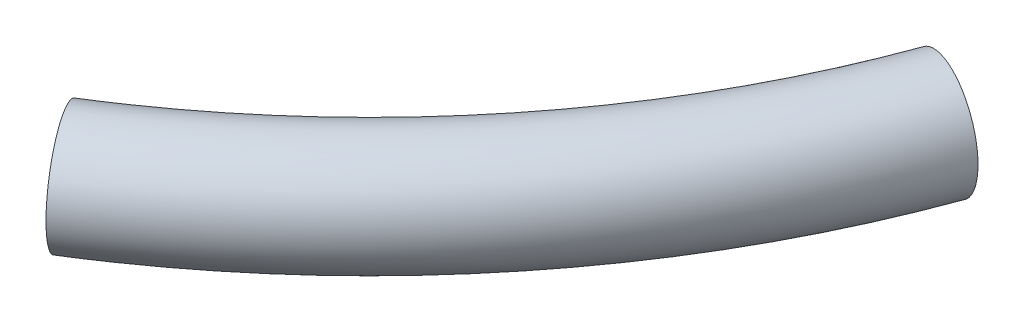
ISO-10303-21;
HEADER;
FILE_DESCRIPTION(('STEP AP214'),'2;1');
FILE_NAME('part.step','',(''),(''),'','','');
FILE_SCHEMA(('AUTOMOTIVE_DESIGN { 1 0 10303 214 1 1 1 1 }'));
ENDSEC;
DATA;
#1=APPLICATION_CONTEXT('core data for automotive mechanical design processes');
#2=APPLICATION_PROTOCOL_DEFINITION('international standard','automotive_design',2000,#1);
#3=PRODUCT_CONTEXT('',#1,'mechanical');
#4=PRODUCT('Part','Part','',(#3));
#5=PRODUCT_RELATED_PRODUCT_CATEGORY('part','',(#4));
#6=PRODUCT_DEFINITION_FORMATION('','',#4);
#7=PRODUCT_DEFINITION_CONTEXT('part definition',#1,'design');
#8=PRODUCT_DEFINITION('design','',#6,#7);
#9=PRODUCT_DEFINITION_SHAPE('','',#8);
#10=(LENGTH_UNIT() NAMED_UNIT(*) SI_UNIT(.MILLI.,.METRE.));
#11=(NAMED_UNIT(*) PLANE_ANGLE_UNIT() SI_UNIT($,.RADIAN.));
#12=(NAMED_UNIT(*) SI_UNIT($,.STERADIAN.) SOLID_ANGLE_UNIT());
#13=UNCERTAINTY_MEASURE_WITH_UNIT(LENGTH_MEASURE(1.E-05),#10,'distance_accuracy_value','');
#14=(GEOMETRIC_REPRESENTATION_CONTEXT(3) GLOBAL_UNCERTAINTY_ASSIGNED_CONTEXT((#13)) GLOBAL_UNIT_ASSIGNED_CONTEXT((#10,
#11,#12)) REPRESENTATION_CONTEXT('',''));
#15=CARTESIAN_POINT('',(0.,0.,0.));
#16=DIRECTION('',(0.,0.,1.));
#17=DIRECTION('',(1.,0.,0.));
#18=AXIS2_PLACEMENT_3D('',#15,#16,#17);
#19=CARTESIAN_POINT('',(0.,6.,0.));
#20=DIRECTION('',(0.342020143325699,0.,-0.939692620785897));
#21=DIRECTION('',(-0.939692620785897,0.,-0.342020143325699));
#22=AXIS2_PLACEMENT_3D('',#19,#20,#21);
#23=PLANE('',#22);
#24=CARTESIAN_POINT('',(6.82421302934355,0.730199999999999,2.48381041497289));
#25=CARTESIAN_POINT('',(6.82421129497327,0.752655241559639,2.48380978371373));
#26=CARTESIAN_POINT('',(6.82242963591551,0.775130857259378,2.4831613128491));
#27=CARTESIAN_POINT('',(6.81534161789126,0.819482451297504,2.48058148526833));
#28=CARTESIAN_POINT('',(6.81002771527244,0.841357041711002,2.47864738288729));
#29=CARTESIAN_POINT('',(6.79603352222431,0.883809618347232,2.47355391316519));
#30=CARTESIAN_POINT('',(6.78735924020571,0.904389843003348,2.47039673270679));
#31=CARTESIAN_POINT('',(6.76687443218714,0.943737337222424,2.46294087233338));
#32=CARTESIAN_POINT('',(6.75505945707419,0.962501982989582,2.45864057307367));
#33=CARTESIAN_POINT('',(6.72865380553962,0.99762748493817,2.44902970189868));
#34=CARTESIAN_POINT('',(6.71406706652031,1.01399169330263,2.44372056308064));
#35=CARTESIAN_POINT('',(6.68249826555502,1.0439048849067,2.4322304591978));
#36=CARTESIAN_POINT('',(6.66551287897885,1.05744989503907,2.42604828406657));
#37=CARTESIAN_POINT('',(6.62965832272644,1.08130194187445,2.41299829282787));
#38=CARTESIAN_POINT('',(6.6107905341322,1.0916113298001,2.40613097939313));
#39=CARTESIAN_POINT('',(6.57169519309986,1.10871348302438,2.39190143895887));
#40=CARTESIAN_POINT('',(6.55146756074491,1.11550604143746,2.38453918287199));
#41=CARTESIAN_POINT('',(6.51022839819317,1.12538061292917,2.36952935521709));
#42=CARTESIAN_POINT('',(6.48921689106719,1.12846273512374,2.36188179204616));
#43=CARTESIAN_POINT('',(6.44700586567826,1.1308293161772,2.34651823524673));
#44=CARTESIAN_POINT('',(6.42580634741531,1.13011377503608,2.33880224161824));
#45=CARTESIAN_POINT('',(6.38382046538139,1.12490525493437,2.32352063029848));
#46=CARTESIAN_POINT('',(6.36303411377941,1.12041216488209,2.31595501703636));
#47=CARTESIAN_POINT('',(6.32246653349717,1.10777635092602,2.30118962533742));
#48=CARTESIAN_POINT('',(6.30268524577036,1.09963384169881,2.2939898254094));
#49=CARTESIAN_POINT('',(6.26467402476153,1.07992311451522,2.28015487239408));
#50=CARTESIAN_POINT('',(6.24644523275613,1.06835240391896,2.27352013469748));
#51=CARTESIAN_POINT('',(6.212097563762,1.04213485030234,2.26101860556719));
#52=CARTESIAN_POINT('',(6.19597577285272,1.02749233015651,2.25515075355315));
#53=CARTESIAN_POINT('',(6.16624800679594,0.99551397474831,2.24433073157725));
#54=CARTESIAN_POINT('',(6.15264561625898,0.97817436557765,2.23937986630693));
#55=CARTESIAN_POINT('',(6.12838903675539,0.941335318357768,2.23055119338251));
#56=CARTESIAN_POINT('',(6.11773068237938,0.921838987081609,2.22667186964338));
#57=CARTESIAN_POINT('',(6.09962219041488,0.881186262625344,2.22008091758085));
#58=CARTESIAN_POINT('',(6.09217780695206,0.860026971539702,2.21737138358792));
#59=CARTESIAN_POINT('',(6.08074974899613,0.816713490035981,2.21321191065649));
#60=CARTESIAN_POINT('',(6.07675870965542,0.794561523394873,2.21175929113269));
#61=CARTESIAN_POINT('',(6.07315247693565,0.758269762147005,2.21044672976486));
#62=CARTESIAN_POINT('',(6.07245784839844,0.744238862857464,2.21019390565344));
#63=CARTESIAN_POINT('',(6.07246066708511,0.707744758440359,2.21019493157149));
#64=CARTESIAN_POINT('',(6.07424232614287,0.685269142740621,2.21084340243612));
#65=CARTESIAN_POINT('',(6.08133034416713,0.640917548702495,2.2134232300169));
#66=CARTESIAN_POINT('',(6.08664424678595,0.619042958288996,2.21535733239793));
#67=CARTESIAN_POINT('',(6.10063843983407,0.576590381652766,2.22045080212003));
#68=CARTESIAN_POINT('',(6.10931272185267,0.55601015699665,2.22360798257843));
#69=CARTESIAN_POINT('',(6.12979752987124,0.516662662777574,2.23106384295185));
#70=CARTESIAN_POINT('',(6.14161250498419,0.497898017010417,2.23536414221156));
#71=CARTESIAN_POINT('',(6.16801815651876,0.462772515061829,2.24497501338655));
#72=CARTESIAN_POINT('',(6.18260489553807,0.446408306697369,2.25028415220459));
#73=CARTESIAN_POINT('',(6.21417369650336,0.4164951150933,2.26177425608743));
#74=CARTESIAN_POINT('',(6.23115908307953,0.402950104960929,2.26795643121866));
#75=CARTESIAN_POINT('',(6.26701363933194,0.379098058125552,2.28100642245736));
#76=CARTESIAN_POINT('',(6.28588142792618,0.368788670199895,2.28787373589209));
#77=CARTESIAN_POINT('',(6.32497676895852,0.351686516975621,2.30210327632635));
#78=CARTESIAN_POINT('',(6.34520440131347,0.344893958562538,2.30946553241323));
#79=CARTESIAN_POINT('',(6.38644356386521,0.335019387070832,2.32447536006813));
#80=CARTESIAN_POINT('',(6.40745507099119,0.331937264876256,2.33212292323906));
#81=CARTESIAN_POINT('',(6.44966609638013,0.329570683822803,2.34748648003849));
#82=CARTESIAN_POINT('',(6.47086561464308,0.330286224963925,2.35520247366699));
#83=CARTESIAN_POINT('',(6.51285149667699,0.335494745065634,2.37048408498675));
#84=CARTESIAN_POINT('',(6.53363784827897,0.339987835117909,2.37804969824886));
#85=CARTESIAN_POINT('',(6.57420542856121,0.352623649073977,2.39281508994781));
#86=CARTESIAN_POINT('',(6.59398671628802,0.360766158301187,2.40001488987582));
#87=CARTESIAN_POINT('',(6.63199793729685,0.380476885484782,2.41384984289115));
#88=CARTESIAN_POINT('',(6.65022672930225,0.392047596081044,2.42048458058774));
#89=CARTESIAN_POINT('',(6.68457439829638,0.418265149697663,2.43298610971804));
#90=CARTESIAN_POINT('',(6.70069618920566,0.432907669843493,2.43885396173208));
#91=CARTESIAN_POINT('',(6.73042395526245,0.464886025251691,2.44967398370798));
#92=CARTESIAN_POINT('',(6.7440263457994,0.482225634422351,2.4546248489783));
#93=CARTESIAN_POINT('',(6.76828292530299,0.519064681642234,2.46345352190271));
#94=CARTESIAN_POINT('',(6.778941279679,0.538561012918393,2.46733284564184));
#95=CARTESIAN_POINT('',(6.79704977164351,0.579213737374658,2.47392379770437));
#96=CARTESIAN_POINT('',(6.80449415510633,0.6003730284603,2.4766333316973));
#97=CARTESIAN_POINT('',(6.81592221306226,0.64368650996402,2.48079280462873));
#98=CARTESIAN_POINT('',(6.81991325240296,0.665838476605129,2.48224542415254));
#99=CARTESIAN_POINT('',(6.82351948512273,0.702130237852995,2.48355798552037));
#100=CARTESIAN_POINT('',(6.82421411365994,0.716161137142535,2.48381080963178));
#101=CARTESIAN_POINT('',(6.82421302934355,0.730199999999999,2.48381041497289));
#102=B_SPLINE_CURVE_WITH_KNOTS('',3,(#24,#25,#26,#27,#28,#29,#30,#31,#32,#33,#34,#35,#36,#37,
#38,#39,#40,#41,#42,#43,#44,#45,#46,#47,#48,#49,#50,#51,#52,#53,#54,#55,#56,#57,#58,#59,#60,#61,
#62,#63,#64,#65,#66,#67,#68,#69,#70,#71,#72,#73,#74,#75,#76,#77,#78,#79,#80,#81,#82,#83,#84,#85,
#86,#87,#88,#89,#90,#91,#92,#93,#94,#95,#96,#97,#98,#99,#100,#101),.UNSPECIFIED.,.T.,.F.,(4,2,2,
2,2,2,2,2,2,2,2,2,2,2,2,2,2,2,2,2,2,2,2,2,2,2,2,2,2,2,2,2,2,2,2,2,2,2,4),(0.,0.0673217190940752,
0.134787678055461,0.2021335594909,0.269575356418626,0.336922056232695,0.40436303479347,
0.471754892083668,0.539150713403567,0.606544552708822,0.673938392014078,0.741334213333977,
0.808726070624174,0.876167049184948,0.94351374899902,1.01095554592846,1.07830142736561,
1.14576738632871,1.2130891054245,1.25517818200736,1.32249990110144,1.38996586006282,
1.45731174149826,1.52475353842599,1.59210023824006,1.65954121680083,1.72693307409103,
1.79432889541093,1.86172273471619,1.92911657402144,1.99651239534134,2.06390425263154,
2.13134523119231,2.19869193100638,2.26613372793582,2.33347960937297,2.40094556833608,
2.46826728743186,2.51035636401472),.UNSPECIFIED.);
#103=CARTESIAN_POINT('',(6.82421302934355,0.730199999999999,2.48381041497289));
#104=VERTEX_POINT('',#103);
#105=EDGE_CURVE('E18',#104,#104,#102,.T.);
#106=ORIENTED_EDGE('',*,*,#105,.F.);
#107=EDGE_LOOP('',(#106));
#108=FACE_BOUND('',#107,.T.);
#109=ADVANCED_FACE('F14',(#108),#23,.T.);
#110=CARTESIAN_POINT('',(0.,6.,0.));
#111=DIRECTION('',(0.848048096156421,0.,-0.529919264233213));
#112=DIRECTION('',(-0.529919264233213,0.,-0.848048096156421));
#113=AXIS2_PLACEMENT_3D('',#110,#111,#112);
#114=PLANE('',#113);
#115=CARTESIAN_POINT('',(3.42443145612806,0.7302,5.48023590157594));
#116=CARTESIAN_POINT('',(3.42443243418855,0.75265524155964,5.48023746679991));
#117=CARTESIAN_POINT('',(3.4254371621561,0.775130857259379,5.48184536765867));
#118=CARTESIAN_POINT('',(3.42943429612651,0.819482451297505,5.48824211916872));
#119=CARTESIAN_POINT('',(3.43243095620841,0.841357041711003,5.49303777776959));
#120=CARTESIAN_POINT('',(3.44032267773475,0.883809618347233,5.50566717222177));
#121=CARTESIAN_POINT('',(3.44521435086634,0.904389843003348,5.51349548563903));
#122=CARTESIAN_POINT('',(3.45676631387322,0.943737337222424,5.53198249091715));
#123=CARTESIAN_POINT('',(3.46342911272925,0.962501982989582,5.54264519798651));
#124=CARTESIAN_POINT('',(3.47832000696772,0.99762748493817,5.56647561020463));
#125=CARTESIAN_POINT('',(3.48654588193757,1.01399169330263,5.57963976195046));
#126=CARTESIAN_POINT('',(3.50434842226854,1.0439048849067,5.60812978194675));
#127=CARTESIAN_POINT('',(3.51392696248271,1.05744989503907,5.6234586505893));
#128=CARTESIAN_POINT('',(3.5341463615164,1.08130194187445,5.65581645301938));
#129=CARTESIAN_POINT('',(3.54478644150469,1.0916113298001,5.67284414041639));
#130=CARTESIAN_POINT('',(3.56683341079714,1.10871348302438,5.7081266666358));
#131=CARTESIAN_POINT('',(3.57824034516866,1.11550604143746,5.72638157758106));
#132=CARTESIAN_POINT('',(3.60149627609077,1.12538061292917,5.76359884684071));
#133=CARTESIAN_POINT('',(3.61334525963107,1.12846273512374,5.78256118433428));
#134=CARTESIAN_POINT('',(3.63714925151294,1.1308293161772,5.82065553447184));
#135=CARTESIAN_POINT('',(3.6491042598545,1.13011377503607,5.83978754711582));
#136=CARTESIAN_POINT('',(3.67278128702641,1.12490525493437,5.87767871124407));
#137=CARTESIAN_POINT('',(3.68450329899433,1.12041216488209,5.89643785174616));
#138=CARTESIAN_POINT('',(3.70738050566741,1.10777635092602,5.9330490355131));
#139=CARTESIAN_POINT('',(3.71853573367059,1.09963384169881,5.95090113206592));
#140=CARTESIAN_POINT('',(3.73997133699879,1.07992311451522,5.98520526822286));
#141=CARTESIAN_POINT('',(3.75025106872563,1.06835240391896,6.00165627785459));
#142=CARTESIAN_POINT('',(3.76962069138614,1.04213485030234,6.03265415381271));
#143=CARTESIAN_POINT('',(3.77871222556209,1.02749233015651,6.04720364987645));
#144=CARTESIAN_POINT('',(3.79547655420281,0.99551397474831,6.07403218385637));
#145=CARTESIAN_POINT('',(3.80314732720423,0.97817436557765,6.08630798675498));
#146=CARTESIAN_POINT('',(3.81682629890096,0.941335318357767,6.10819891748303));
#147=CARTESIAN_POINT('',(3.82283684658851,0.921838987081608,6.11781780448587));
#148=CARTESIAN_POINT('',(3.83304873771753,0.881186262625342,6.13416024646644));
#149=CARTESIAN_POINT('',(3.83724683624466,0.8600269715397,6.14087860849573));
#150=CARTESIAN_POINT('',(3.84369144156524,0.816713490035979,6.15119213291629));
#151=CARTESIAN_POINT('',(3.84594210160467,0.794561523394871,6.15479394189053));
#152=CARTESIAN_POINT('',(3.84797575829968,0.758269762147004,6.15804847291977));
#153=CARTESIAN_POINT('',(3.84836747899133,0.744238862857464,6.15867535706836));
#154=CARTESIAN_POINT('',(3.84836588945414,0.70774475844036,6.15867281327711));
#155=CARTESIAN_POINT('',(3.8473611614866,0.685269142740621,6.15706491241835));
#156=CARTESIAN_POINT('',(3.84336402751619,0.640917548702495,6.15066816090831));
#157=CARTESIAN_POINT('',(3.84036736743428,0.619042958288997,6.14587250230743));
#158=CARTESIAN_POINT('',(3.83247564590794,0.576590381652766,6.13324310785525));
#159=CARTESIAN_POINT('',(3.82758397277636,0.556010156996651,6.12541479443799));
#160=CARTESIAN_POINT('',(3.81603200976947,0.516662662777575,6.10692778915987));
#161=CARTESIAN_POINT('',(3.80936921091345,0.497898017010418,6.09626508209052));
#162=CARTESIAN_POINT('',(3.79447831667497,0.462772515061829,6.07243466987239));
#163=CARTESIAN_POINT('',(3.78625244170512,0.446408306697369,6.05927051812657));
#164=CARTESIAN_POINT('',(3.76844990137416,0.4164951150933,6.03078049813028));
#165=CARTESIAN_POINT('',(3.75887136115999,0.402950104960929,6.01545162948772));
#166=CARTESIAN_POINT('',(3.7386519621263,0.379098058125552,5.98309382705765));
#167=CARTESIAN_POINT('',(3.728011882138,0.368788670199895,5.96606613966063));
#168=CARTESIAN_POINT('',(3.70596491284556,0.351686516975621,5.93078361344123));
#169=CARTESIAN_POINT('',(3.69455797847403,0.344893958562538,5.91252870249596));
#170=CARTESIAN_POINT('',(3.67130204755192,0.335019387070832,5.87531143323632));
#171=CARTESIAN_POINT('',(3.65945306401162,0.331937264876257,5.85634909574274));
#172=CARTESIAN_POINT('',(3.63564907212976,0.329570683822803,5.81825474560519));
#173=CARTESIAN_POINT('',(3.62369406378819,0.330286224963925,5.79912273296121));
#174=CARTESIAN_POINT('',(3.60001703661628,0.335494745065634,5.76123156883296));
#175=CARTESIAN_POINT('',(3.58829502464837,0.339987835117909,5.74247242833086));
#176=CARTESIAN_POINT('',(3.56541781797529,0.352623649073977,5.70586124456393));
#177=CARTESIAN_POINT('',(3.5542625899721,0.360766158301187,5.68800914801111));
#178=CARTESIAN_POINT('',(3.5328269866439,0.380476885484782,5.65370501185416));
#179=CARTESIAN_POINT('',(3.52254725491707,0.392047596081044,5.63725400222244));
#180=CARTESIAN_POINT('',(3.50317763225655,0.418265149697663,5.60625612626431));
#181=CARTESIAN_POINT('',(3.4940860980806,0.432907669843493,5.59170663020058));
#182=CARTESIAN_POINT('',(3.47732176943988,0.46488602525169,5.56487809622065));
#183=CARTESIAN_POINT('',(3.46965099643847,0.482225634422349,5.55260229332205));
#184=CARTESIAN_POINT('',(3.45597202474174,0.519064681642232,5.530711362594));
#185=CARTESIAN_POINT('',(3.44996147705419,0.538561012918392,5.52109247559116));
#186=CARTESIAN_POINT('',(3.43974958592517,0.579213737374658,5.50475003361059));
#187=CARTESIAN_POINT('',(3.43555148739803,0.6003730284603,5.49803167158129));
#188=CARTESIAN_POINT('',(3.42910688207746,0.64368650996402,5.48771814716073));
#189=CARTESIAN_POINT('',(3.42685622203802,0.665838476605129,5.4841163381865));
#190=CARTESIAN_POINT('',(3.42482256534301,0.702130237852995,5.48086180715726));
#191=CARTESIAN_POINT('',(3.42443084465136,0.716161137142536,5.48023492300866));
#192=CARTESIAN_POINT('',(3.42443145612806,0.7302,5.48023590157594));
#193=B_SPLINE_CURVE_WITH_KNOTS('',3,(#115,#116,#117,#118,#119,#120,#121,#122,#123,#124,#125,
#126,#127,#128,#129,#130,#131,#132,#133,#134,#135,#136,#137,#138,#139,#140,#141,#142,#143,#144,
#145,#146,#147,#148,#149,#150,#151,#152,#153,#154,#155,#156,#157,#158,#159,#160,#161,#162,#163,
#164,#165,#166,#167,#168,#169,#170,#171,#172,#173,#174,#175,#176,#177,#178,#179,#180,#181,#182,
#183,#184,#185,#186,#187,#188,#189,#190,#191,#192),.UNSPECIFIED.,.T.,.F.,(4,2,2,2,2,2,2,2,2,2,2,
2,2,2,2,2,2,2,2,2,2,2,2,2,2,2,2,2,2,2,2,2,2,2,2,2,2,2,4),(0.,0.0673217190940751,
0.134787678055461,0.202133559490899,0.269575356418625,0.336922056232693,0.40436303479347,
0.471754892083667,0.539150713403566,0.606544552708823,0.673938392014079,0.741334213333977,
0.808726070624175,0.876167049184949,0.943513748999019,1.01095554592846,1.07830142736561,
1.14576738632871,1.2130891054245,1.25517818200736,1.32249990110144,1.38996586006282,
1.45731174149826,1.52475353842599,1.59210023824006,1.65954121680083,1.72693307409103,
1.79432889541093,1.86172273471618,1.92911657402144,1.99651239534134,2.06390425263154,
2.13134523119231,2.19869193100638,2.26613372793582,2.33347960937297,2.40094556833608,
2.46826728743186,2.51035636401472),.UNSPECIFIED.);
#194=CARTESIAN_POINT('',(3.42443145612806,0.7302,5.48023590157594));
#195=VERTEX_POINT('',#194);
#196=EDGE_CURVE('E10',#195,#195,#193,.T.);
#197=ORIENTED_EDGE('',*,*,#196,.F.);
#198=EDGE_LOOP('',(#197));
#199=FACE_BOUND('',#198,.T.);
#200=ADVANCED_FACE('F34',(#199),#114,.F.);
#201=CARTESIAN_POINT('',(0.,0.7302,0.));
#202=DIRECTION('',(0.,-1.,0.));
#203=DIRECTION('',(0.342020143325699,0.,-0.939692620785897));
#204=AXIS2_PLACEMENT_3D('',#201,#202,#203);
#205=TOROIDAL_SURFACE('',#204,6.862175820468,0.4);
#206=ORIENTED_EDGE('',*,*,#196,.T.);
#207=EDGE_LOOP('',(#206));
#208=FACE_BOUND('',#207,.T.);
#209=ORIENTED_EDGE('',*,*,#105,.T.);
#210=EDGE_LOOP('',(#209));
#211=FACE_BOUND('',#210,.T.);
#212=ADVANCED_FACE('F36',(#208,#211),#205,.T.);
#213=CLOSED_SHELL('',(#109,#200,#212));
#214=MANIFOLD_SOLID_BREP('B1',#213);
#215=ADVANCED_BREP_SHAPE_REPRESENTATION('',(#18,#214),#14);
#216=SHAPE_DEFINITION_REPRESENTATION(#9,#215);
ENDSEC;
END-ISO-10303-21;
